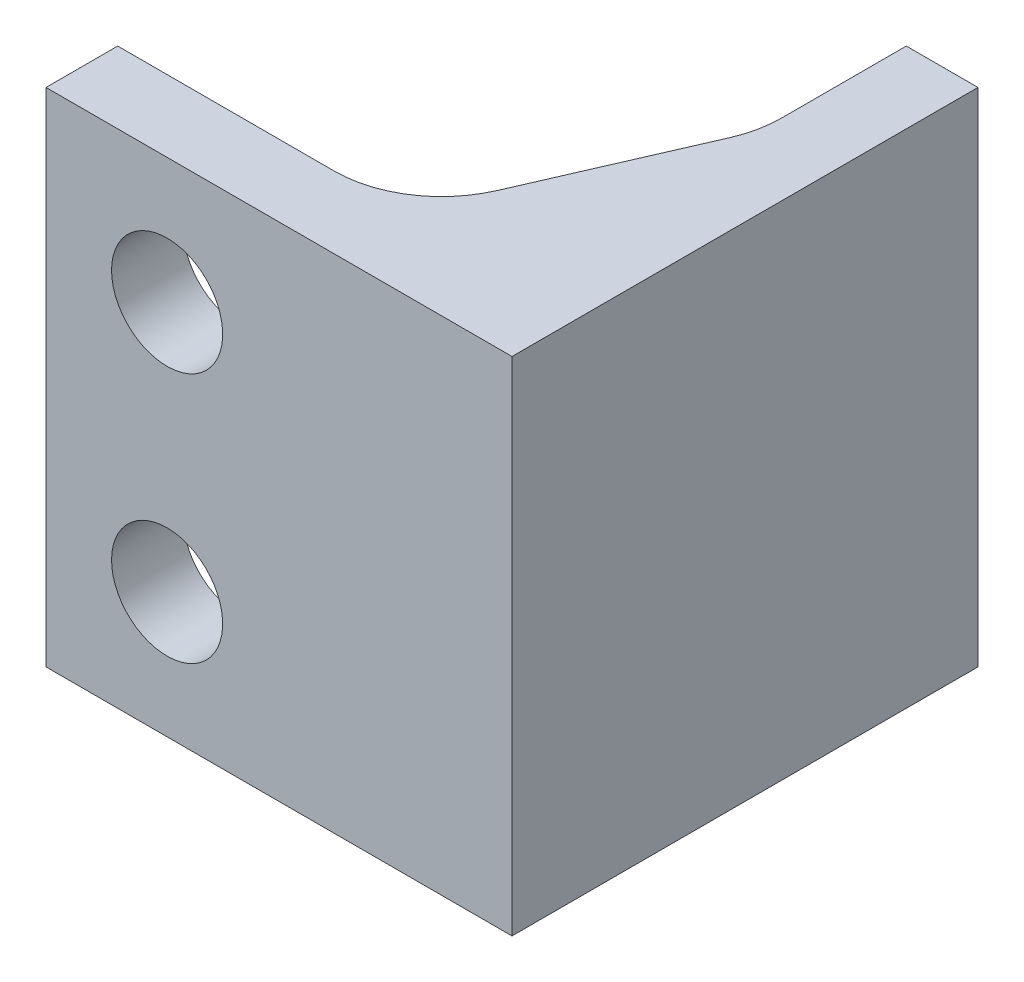
ISO-10303-21;
HEADER;
FILE_DESCRIPTION(('STEP AP214'),'2;1');
FILE_NAME('part.step','',(''),(''),'','','');
FILE_SCHEMA(('AUTOMOTIVE_DESIGN { 1 0 10303 214 1 1 1 1 }'));
ENDSEC;
DATA;
#1=APPLICATION_CONTEXT('core data for automotive mechanical design processes');
#2=APPLICATION_PROTOCOL_DEFINITION('international standard','automotive_design',2000,#1);
#3=PRODUCT_CONTEXT('',#1,'mechanical');
#4=PRODUCT('Part','Part','',(#3));
#5=PRODUCT_RELATED_PRODUCT_CATEGORY('part','',(#4));
#6=PRODUCT_DEFINITION_FORMATION('','',#4);
#7=PRODUCT_DEFINITION_CONTEXT('part definition',#1,'design');
#8=PRODUCT_DEFINITION('design','',#6,#7);
#9=PRODUCT_DEFINITION_SHAPE('','',#8);
#10=(LENGTH_UNIT() NAMED_UNIT(*) SI_UNIT(.MILLI.,.METRE.));
#11=(NAMED_UNIT(*) PLANE_ANGLE_UNIT() SI_UNIT($,.RADIAN.));
#12=(NAMED_UNIT(*) SI_UNIT($,.STERADIAN.) SOLID_ANGLE_UNIT());
#13=UNCERTAINTY_MEASURE_WITH_UNIT(LENGTH_MEASURE(1.E-05),#10,'distance_accuracy_value','');
#14=(GEOMETRIC_REPRESENTATION_CONTEXT(3) GLOBAL_UNCERTAINTY_ASSIGNED_CONTEXT((#13)) GLOBAL_UNIT_ASSIGNED_CONTEXT((#10,
#11,#12)) REPRESENTATION_CONTEXT('',''));
#15=CARTESIAN_POINT('',(0.,0.,0.));
#16=DIRECTION('',(0.,0.,1.));
#17=DIRECTION('',(1.,0.,0.));
#18=AXIS2_PLACEMENT_3D('',#15,#16,#17);
#19=CARTESIAN_POINT('',(0.,7.,-13.));
#20=DIRECTION('',(-1.,0.,0.));
#21=DIRECTION('',(0.,0.,1.));
#22=AXIS2_PLACEMENT_3D('',#19,#20,#21);
#23=PLANE('',#22);
#24=DIRECTION('',(0.,0.,-1.));
#25=VECTOR('',#24,1.);
#26=CARTESIAN_POINT('',(0.,0.,-13.));
#27=LINE('',#26,#25);
#28=CARTESIAN_POINT('',(0.,0.,0.));
#29=VERTEX_POINT('',#28);
#30=CARTESIAN_POINT('',(0.,0.,-13.));
#31=VERTEX_POINT('',#30);
#32=EDGE_CURVE('E116',#29,#31,#27,.T.);
#33=ORIENTED_EDGE('',*,*,#32,.T.);
#34=DIRECTION('',(0.,-1.,0.));
#35=VECTOR('',#34,1.);
#36=CARTESIAN_POINT('',(0.,7.,-13.));
#37=LINE('',#36,#35);
#38=CARTESIAN_POINT('',(0.,14.,-13.));
#39=VERTEX_POINT('',#38);
#40=EDGE_CURVE('E11',#39,#31,#37,.T.);
#41=ORIENTED_EDGE('',*,*,#40,.F.);
#42=DIRECTION('',(0.,0.,-1.));
#43=VECTOR('',#42,1.);
#44=CARTESIAN_POINT('',(0.,14.,-13.));
#45=LINE('',#44,#43);
#46=CARTESIAN_POINT('',(0.,14.,0.));
#47=VERTEX_POINT('',#46);
#48=EDGE_CURVE('E114',#47,#39,#45,.T.);
#49=ORIENTED_EDGE('',*,*,#48,.F.);
#50=DIRECTION('',(0.,-1.,0.));
#51=VECTOR('',#50,1.);
#52=CARTESIAN_POINT('',(0.,7.,0.));
#53=LINE('',#52,#51);
#54=EDGE_CURVE('E176',#47,#29,#53,.T.);
#55=ORIENTED_EDGE('',*,*,#54,.T.);
#56=EDGE_LOOP('',(#33,#41,#49,#55));
#57=FACE_BOUND('',#56,.T.);
#58=ADVANCED_FACE('F41',(#57),#23,.F.);
#59=CARTESIAN_POINT('',(-2.,7.,-13.));
#60=DIRECTION('',(0.,0.,1.));
#61=DIRECTION('',(1.,0.,0.));
#62=AXIS2_PLACEMENT_3D('',#59,#60,#61);
#63=PLANE('',#62);
#64=DIRECTION('',(-1.,0.,0.));
#65=VECTOR('',#64,1.);
#66=CARTESIAN_POINT('',(-2.,0.,-13.));
#67=LINE('',#66,#65);
#68=CARTESIAN_POINT('',(-2.,0.,-13.));
#69=VERTEX_POINT('',#68);
#70=EDGE_CURVE('E162',#31,#69,#67,.T.);
#71=ORIENTED_EDGE('',*,*,#70,.T.);
#72=DIRECTION('',(0.,-1.,0.));
#73=VECTOR('',#72,1.);
#74=CARTESIAN_POINT('',(-2.,7.,-13.));
#75=LINE('',#74,#73);
#76=CARTESIAN_POINT('',(-2.,14.,-13.));
#77=VERTEX_POINT('',#76);
#78=EDGE_CURVE('E48',#77,#69,#75,.T.);
#79=ORIENTED_EDGE('',*,*,#78,.F.);
#80=DIRECTION('',(-1.,0.,0.));
#81=VECTOR('',#80,1.);
#82=CARTESIAN_POINT('',(-2.,14.,-13.));
#83=LINE('',#82,#81);
#84=EDGE_CURVE('E119',#39,#77,#83,.T.);
#85=ORIENTED_EDGE('',*,*,#84,.F.);
#86=ORIENTED_EDGE('',*,*,#40,.T.);
#87=EDGE_LOOP('',(#71,#79,#85,#86));
#88=FACE_BOUND('',#87,.T.);
#89=ADVANCED_FACE('F120',(#88),#63,.F.);
#90=CARTESIAN_POINT('',(-2.,7.,-9.52259742413722));
#91=DIRECTION('',(1.,0.,0.));
#92=DIRECTION('',(0.,0.,-1.));
#93=AXIS2_PLACEMENT_3D('',#90,#91,#92);
#94=PLANE('',#93);
#95=DIRECTION('',(0.,0.,1.));
#96=VECTOR('',#95,1.);
#97=CARTESIAN_POINT('',(-2.,0.,-9.52259742413722));
#98=LINE('',#97,#96);
#99=CARTESIAN_POINT('',(-2.,0.,-9.52259742413722));
#100=VERTEX_POINT('',#99);
#101=EDGE_CURVE('E164',#69,#100,#98,.T.);
#102=ORIENTED_EDGE('',*,*,#101,.T.);
#103=DIRECTION('',(0.,-1.,0.));
#104=VECTOR('',#103,1.);
#105=CARTESIAN_POINT('',(-2.,7.,-9.52259742413722));
#106=LINE('',#105,#104);
#107=CARTESIAN_POINT('',(-2.,14.,-9.52259742413722));
#108=VERTEX_POINT('',#107);
#109=EDGE_CURVE('E191',#108,#100,#106,.T.);
#110=ORIENTED_EDGE('',*,*,#109,.F.);
#111=DIRECTION('',(0.,0.,1.));
#112=VECTOR('',#111,1.);
#113=CARTESIAN_POINT('',(-2.,14.,-9.52259742413722));
#114=LINE('',#113,#112);
#115=EDGE_CURVE('E125',#77,#108,#114,.T.);
#116=ORIENTED_EDGE('',*,*,#115,.F.);
#117=ORIENTED_EDGE('',*,*,#78,.T.);
#118=EDGE_LOOP('',(#102,#110,#116,#117));
#119=FACE_BOUND('',#118,.T.);
#120=ADVANCED_FACE('F195',(#119),#94,.F.);
#121=CARTESIAN_POINT('',(-5.,7.,-9.52259742413721));
#122=DIRECTION('',(0.,-1.,0.));
#123=DIRECTION('',(0.,0.,-1.));
#124=AXIS2_PLACEMENT_3D('',#121,#122,#123);
#125=CYLINDRICAL_SURFACE('',#124,3.);
#126=CARTESIAN_POINT('',(-5.,0.,-9.52259742413721));
#127=DIRECTION('',(0.,-1.,0.));
#128=DIRECTION('',(0.,0.,-1.));
#129=AXIS2_PLACEMENT_3D('',#126,#127,#128);
#130=CIRCLE('',#129,3.);
#131=CARTESIAN_POINT('',(-2.24888416267151,0.,-8.32620215099361));
#132=VERTEX_POINT('',#131);
#133=EDGE_CURVE('E166',#100,#132,#130,.T.);
#134=ORIENTED_EDGE('',*,*,#133,.T.);
#135=DIRECTION('',(0.,-1.,0.));
#136=VECTOR('',#135,1.);
#137=CARTESIAN_POINT('',(-2.24888416267151,7.,-8.32620215099361));
#138=LINE('',#137,#136);
#139=CARTESIAN_POINT('',(-2.24888416267151,14.,-8.32620215099361));
#140=VERTEX_POINT('',#139);
#141=EDGE_CURVE('E188',#140,#132,#138,.T.);
#142=ORIENTED_EDGE('',*,*,#141,.F.);
#143=CARTESIAN_POINT('',(-5.,14.,-9.52259742413721));
#144=DIRECTION('',(0.,-1.,0.));
#145=DIRECTION('',(0.,0.,-1.));
#146=AXIS2_PLACEMENT_3D('',#143,#144,#145);
#147=CIRCLE('',#146,3.);
#148=EDGE_CURVE('E140',#108,#140,#147,.T.);
#149=ORIENTED_EDGE('',*,*,#148,.F.);
#150=ORIENTED_EDGE('',*,*,#109,.T.);
#151=EDGE_LOOP('',(#134,#142,#149,#150));
#152=FACE_BOUND('',#151,.T.);
#153=ADVANCED_FACE('F202',(#152),#125,.F.);
#154=CARTESIAN_POINT('',(-4.21565492061365,7.,-3.8036047268564));
#155=DIRECTION('',(0.91703861244283,0.,0.398798424381201));
#156=DIRECTION('',(0.398798424381201,0.,-0.91703861244283));
#157=AXIS2_PLACEMENT_3D('',#154,#155,#156);
#158=PLANE('',#157);
#159=DIRECTION('',(-0.398798424381201,0.,0.91703861244283));
#160=VECTOR('',#159,1.);
#161=CARTESIAN_POINT('',(-4.21565492061365,0.,-3.8036047268564));
#162=LINE('',#161,#160);
#163=CARTESIAN_POINT('',(-4.21565492061365,0.,-3.8036047268564));
#164=VERTEX_POINT('',#163);
#165=EDGE_CURVE('E168',#132,#164,#162,.T.);
#166=ORIENTED_EDGE('',*,*,#165,.T.);
#167=DIRECTION('',(0.,-1.,0.));
#168=VECTOR('',#167,1.);
#169=CARTESIAN_POINT('',(-4.21565492061365,7.,-3.8036047268564));
#170=LINE('',#169,#168);
#171=CARTESIAN_POINT('',(-4.21565492061365,14.,-3.8036047268564));
#172=VERTEX_POINT('',#171);
#173=EDGE_CURVE('E185',#172,#164,#170,.T.);
#174=ORIENTED_EDGE('',*,*,#173,.F.);
#175=DIRECTION('',(-0.398798424381201,0.,0.91703861244283));
#176=VECTOR('',#175,1.);
#177=CARTESIAN_POINT('',(-4.21565492061365,14.,-3.8036047268564));
#178=LINE('',#177,#176);
#179=EDGE_CURVE('E143',#140,#172,#178,.T.);
#180=ORIENTED_EDGE('',*,*,#179,.F.);
#181=ORIENTED_EDGE('',*,*,#141,.T.);
#182=EDGE_LOOP('',(#166,#174,#180,#181));
#183=FACE_BOUND('',#182,.T.);
#184=ADVANCED_FACE('F206',(#183),#158,.F.);
#185=CARTESIAN_POINT('',(-6.96677075794214,7.,-5.));
#186=DIRECTION('',(0.,-1.,0.));
#187=DIRECTION('',(0.,0.,-1.));
#188=AXIS2_PLACEMENT_3D('',#185,#186,#187);
#189=CYLINDRICAL_SURFACE('',#188,3.);
#190=CARTESIAN_POINT('',(-6.96677075794214,0.,-5.));
#191=DIRECTION('',(0.,-1.,0.));
#192=DIRECTION('',(0.,0.,-1.));
#193=AXIS2_PLACEMENT_3D('',#190,#191,#192);
#194=CIRCLE('',#193,3.);
#195=CARTESIAN_POINT('',(-6.96677075794214,0.,-2.));
#196=VERTEX_POINT('',#195);
#197=EDGE_CURVE('E170',#164,#196,#194,.T.);
#198=ORIENTED_EDGE('',*,*,#197,.T.);
#199=DIRECTION('',(0.,-1.,0.));
#200=VECTOR('',#199,1.);
#201=CARTESIAN_POINT('',(-6.96677075794214,7.,-2.));
#202=LINE('',#201,#200);
#203=CARTESIAN_POINT('',(-6.96677075794214,14.,-2.));
#204=VERTEX_POINT('',#203);
#205=EDGE_CURVE('E182',#204,#196,#202,.T.);
#206=ORIENTED_EDGE('',*,*,#205,.F.);
#207=CARTESIAN_POINT('',(-6.96677075794214,14.,-5.));
#208=DIRECTION('',(0.,-1.,0.));
#209=DIRECTION('',(0.,0.,-1.));
#210=AXIS2_PLACEMENT_3D('',#207,#208,#209);
#211=CIRCLE('',#210,3.);
#212=EDGE_CURVE('E146',#172,#204,#211,.T.);
#213=ORIENTED_EDGE('',*,*,#212,.F.);
#214=ORIENTED_EDGE('',*,*,#173,.T.);
#215=EDGE_LOOP('',(#198,#206,#213,#214));
#216=FACE_BOUND('',#215,.T.);
#217=ADVANCED_FACE('F210',(#216),#189,.F.);
#218=CARTESIAN_POINT('',(-13.,7.,-2.));
#219=DIRECTION('',(0.,0.,1.));
#220=DIRECTION('',(1.,0.,0.));
#221=AXIS2_PLACEMENT_3D('',#218,#219,#220);
#222=PLANE('',#221);
#223=CARTESIAN_POINT('',(-9.62132034355965,3.5,-2.));
#224=DIRECTION('',(0.,0.,-1.));
#225=DIRECTION('',(-1.,0.,0.));
#226=AXIS2_PLACEMENT_3D('',#223,#224,#225);
#227=CIRCLE('',#226,1.55);
#228=CARTESIAN_POINT('',(-11.1713203435596,3.5,-2.));
#229=VERTEX_POINT('',#228);
#230=EDGE_CURVE('E155',#229,#229,#227,.T.);
#231=ORIENTED_EDGE('',*,*,#230,.F.);
#232=EDGE_LOOP('',(#231));
#233=FACE_BOUND('',#232,.T.);
#234=DIRECTION('',(-1.,0.,0.));
#235=VECTOR('',#234,1.);
#236=CARTESIAN_POINT('',(-13.,0.,-2.));
#237=LINE('',#236,#235);
#238=CARTESIAN_POINT('',(-13.,0.,-2.));
#239=VERTEX_POINT('',#238);
#240=EDGE_CURVE('E172',#196,#239,#237,.T.);
#241=ORIENTED_EDGE('',*,*,#240,.T.);
#242=DIRECTION('',(0.,-1.,0.));
#243=VECTOR('',#242,1.);
#244=CARTESIAN_POINT('',(-13.,7.,-2.));
#245=LINE('',#244,#243);
#246=CARTESIAN_POINT('',(-13.,14.,-2.));
#247=VERTEX_POINT('',#246);
#248=EDGE_CURVE('E180',#247,#239,#245,.T.);
#249=ORIENTED_EDGE('',*,*,#248,.F.);
#250=DIRECTION('',(-1.,0.,0.));
#251=VECTOR('',#250,1.);
#252=CARTESIAN_POINT('',(-13.,14.,-2.));
#253=LINE('',#252,#251);
#254=EDGE_CURVE('E149',#204,#247,#253,.T.);
#255=ORIENTED_EDGE('',*,*,#254,.F.);
#256=ORIENTED_EDGE('',*,*,#205,.T.);
#257=EDGE_LOOP('',(#241,#249,#255,#256));
#258=FACE_BOUND('',#257,.T.);
#259=CARTESIAN_POINT('',(-9.62132034355965,10.5,-2.));
#260=DIRECTION('',(0.,0.,1.));
#261=DIRECTION('',(-1.,0.,0.));
#262=AXIS2_PLACEMENT_3D('',#259,#260,#261);
#263=CIRCLE('',#262,1.55);
#264=CARTESIAN_POINT('',(-11.1713203435596,10.5,-2.));
#265=VERTEX_POINT('',#264);
#266=EDGE_CURVE('E135',#265,#265,#263,.T.);
#267=ORIENTED_EDGE('',*,*,#266,.T.);
#268=EDGE_LOOP('',(#267));
#269=FACE_BOUND('',#268,.T.);
#270=ADVANCED_FACE('F213',(#233,#258,#269),#222,.F.);
#271=CARTESIAN_POINT('',(-13.,7.,0.));
#272=DIRECTION('',(1.,0.,0.));
#273=DIRECTION('',(0.,0.,-1.));
#274=AXIS2_PLACEMENT_3D('',#271,#272,#273);
#275=PLANE('',#274);
#276=DIRECTION('',(0.,0.,1.));
#277=VECTOR('',#276,1.);
#278=CARTESIAN_POINT('',(-13.,0.,0.));
#279=LINE('',#278,#277);
#280=CARTESIAN_POINT('',(-13.,0.,0.));
#281=VERTEX_POINT('',#280);
#282=EDGE_CURVE('E63',#239,#281,#279,.T.);
#283=ORIENTED_EDGE('',*,*,#282,.T.);
#284=DIRECTION('',(0.,-1.,0.));
#285=VECTOR('',#284,1.);
#286=CARTESIAN_POINT('',(-13.,7.,0.));
#287=LINE('',#286,#285);
#288=CARTESIAN_POINT('',(-13.,14.,0.));
#289=VERTEX_POINT('',#288);
#290=EDGE_CURVE('E178',#289,#281,#287,.T.);
#291=ORIENTED_EDGE('',*,*,#290,.F.);
#292=DIRECTION('',(0.,0.,1.));
#293=VECTOR('',#292,1.);
#294=CARTESIAN_POINT('',(-13.,14.,0.));
#295=LINE('',#294,#293);
#296=EDGE_CURVE('E152',#247,#289,#295,.T.);
#297=ORIENTED_EDGE('',*,*,#296,.F.);
#298=ORIENTED_EDGE('',*,*,#248,.T.);
#299=EDGE_LOOP('',(#283,#291,#297,#298));
#300=FACE_BOUND('',#299,.T.);
#301=ADVANCED_FACE('F216',(#300),#275,.F.);
#302=CARTESIAN_POINT('',(0.,7.,0.));
#303=DIRECTION('',(0.,0.,-1.));
#304=DIRECTION('',(-1.,0.,0.));
#305=AXIS2_PLACEMENT_3D('',#302,#303,#304);
#306=PLANE('',#305);
#307=CARTESIAN_POINT('',(-9.62132034355965,3.5,0.));
#308=DIRECTION('',(0.,0.,-1.));
#309=DIRECTION('',(-1.,0.,0.));
#310=AXIS2_PLACEMENT_3D('',#307,#308,#309);
#311=CIRCLE('',#310,1.55);
#312=CARTESIAN_POINT('',(-11.1713203435596,3.5,0.));
#313=VERTEX_POINT('',#312);
#314=EDGE_CURVE('E158',#313,#313,#311,.F.);
#315=ORIENTED_EDGE('',*,*,#314,.F.);
#316=EDGE_LOOP('',(#315));
#317=FACE_BOUND('',#316,.T.);
#318=DIRECTION('',(1.,0.,0.));
#319=VECTOR('',#318,1.);
#320=CARTESIAN_POINT('',(0.,0.,0.));
#321=LINE('',#320,#319);
#322=EDGE_CURVE('E55',#281,#29,#321,.T.);
#323=ORIENTED_EDGE('',*,*,#322,.T.);
#324=ORIENTED_EDGE('',*,*,#54,.F.);
#325=DIRECTION('',(1.,0.,0.));
#326=VECTOR('',#325,1.);
#327=CARTESIAN_POINT('',(0.,14.,0.));
#328=LINE('',#327,#326);
#329=EDGE_CURVE('E131',#289,#47,#328,.T.);
#330=ORIENTED_EDGE('',*,*,#329,.F.);
#331=ORIENTED_EDGE('',*,*,#290,.T.);
#332=EDGE_LOOP('',(#323,#324,#330,#331));
#333=FACE_BOUND('',#332,.T.);
#334=CARTESIAN_POINT('',(-9.62132034355965,10.5,0.));
#335=DIRECTION('',(0.,0.,1.));
#336=DIRECTION('',(-1.,0.,0.));
#337=AXIS2_PLACEMENT_3D('',#334,#335,#336);
#338=CIRCLE('',#337,1.55);
#339=CARTESIAN_POINT('',(-11.1713203435596,10.5,0.));
#340=VERTEX_POINT('',#339);
#341=EDGE_CURVE('E132',#340,#340,#338,.F.);
#342=ORIENTED_EDGE('',*,*,#341,.T.);
#343=EDGE_LOOP('',(#342));
#344=FACE_BOUND('',#343,.T.);
#345=ADVANCED_FACE('F217',(#317,#333,#344),#306,.F.);
#346=CARTESIAN_POINT('',(-6.96677075794214,0.,-5.));
#347=DIRECTION('',(0.,-1.,0.));
#348=DIRECTION('',(0.,0.,-1.));
#349=AXIS2_PLACEMENT_3D('',#346,#347,#348);
#350=PLANE('',#349);
#351=ORIENTED_EDGE('',*,*,#32,.F.);
#352=ORIENTED_EDGE('',*,*,#322,.F.);
#353=ORIENTED_EDGE('',*,*,#282,.F.);
#354=ORIENTED_EDGE('',*,*,#240,.F.);
#355=ORIENTED_EDGE('',*,*,#197,.F.);
#356=ORIENTED_EDGE('',*,*,#165,.F.);
#357=ORIENTED_EDGE('',*,*,#133,.F.);
#358=ORIENTED_EDGE('',*,*,#101,.F.);
#359=ORIENTED_EDGE('',*,*,#70,.F.);
#360=EDGE_LOOP('',(#351,#352,#353,#354,#355,#356,#357,#358,#359));
#361=FACE_BOUND('',#360,.T.);
#362=ADVANCED_FACE('F198',(#361),#350,.T.);
#363=CARTESIAN_POINT('',(-9.62132034355965,3.5,0.00100000000000013));
#364=DIRECTION('',(0.,0.,-1.));
#365=DIRECTION('',(-1.,0.,0.));
#366=AXIS2_PLACEMENT_3D('',#363,#364,#365);
#367=CYLINDRICAL_SURFACE('',#366,1.55);
#368=ORIENTED_EDGE('',*,*,#230,.T.);
#369=EDGE_LOOP('',(#368));
#370=FACE_BOUND('',#369,.T.);
#371=ORIENTED_EDGE('',*,*,#314,.T.);
#372=EDGE_LOOP('',(#371));
#373=FACE_BOUND('',#372,.T.);
#374=ADVANCED_FACE('F231',(#370,#373),#367,.F.);
#375=CARTESIAN_POINT('',(-6.96677075794214,14.,-5.));
#376=DIRECTION('',(0.,1.,0.));
#377=DIRECTION('',(0.,0.,-1.));
#378=AXIS2_PLACEMENT_3D('',#375,#376,#377);
#379=PLANE('',#378);
#380=ORIENTED_EDGE('',*,*,#48,.T.);
#381=ORIENTED_EDGE('',*,*,#84,.T.);
#382=ORIENTED_EDGE('',*,*,#115,.T.);
#383=ORIENTED_EDGE('',*,*,#148,.T.);
#384=ORIENTED_EDGE('',*,*,#179,.T.);
#385=ORIENTED_EDGE('',*,*,#212,.T.);
#386=ORIENTED_EDGE('',*,*,#254,.T.);
#387=ORIENTED_EDGE('',*,*,#296,.T.);
#388=ORIENTED_EDGE('',*,*,#329,.T.);
#389=EDGE_LOOP('',(#380,#381,#382,#383,#384,#385,#386,#387,#388));
#390=FACE_BOUND('',#389,.T.);
#391=ADVANCED_FACE('F128',(#390),#379,.T.);
#392=CARTESIAN_POINT('',(-9.62132034355965,10.5,0.00100000000000013));
#393=DIRECTION('',(0.,0.,-1.));
#394=DIRECTION('',(-1.,0.,0.));
#395=AXIS2_PLACEMENT_3D('',#392,#393,#394);
#396=CYLINDRICAL_SURFACE('',#395,1.55);
#397=ORIENTED_EDGE('',*,*,#266,.F.);
#398=EDGE_LOOP('',(#397));
#399=FACE_BOUND('',#398,.T.);
#400=ORIENTED_EDGE('',*,*,#341,.F.);
#401=EDGE_LOOP('',(#400));
#402=FACE_BOUND('',#401,.T.);
#403=ADVANCED_FACE('F224',(#399,#402),#396,.F.);
#404=CLOSED_SHELL('',(#58,#89,#120,#153,#184,#217,#270,#301,#345,#362,#374,#391,#403));
#405=MANIFOLD_SOLID_BREP('B2',#404);
#406=ADVANCED_BREP_SHAPE_REPRESENTATION('',(#18,#405),#14);
#407=SHAPE_DEFINITION_REPRESENTATION(#9,#406);
ENDSEC;
END-ISO-10303-21;
